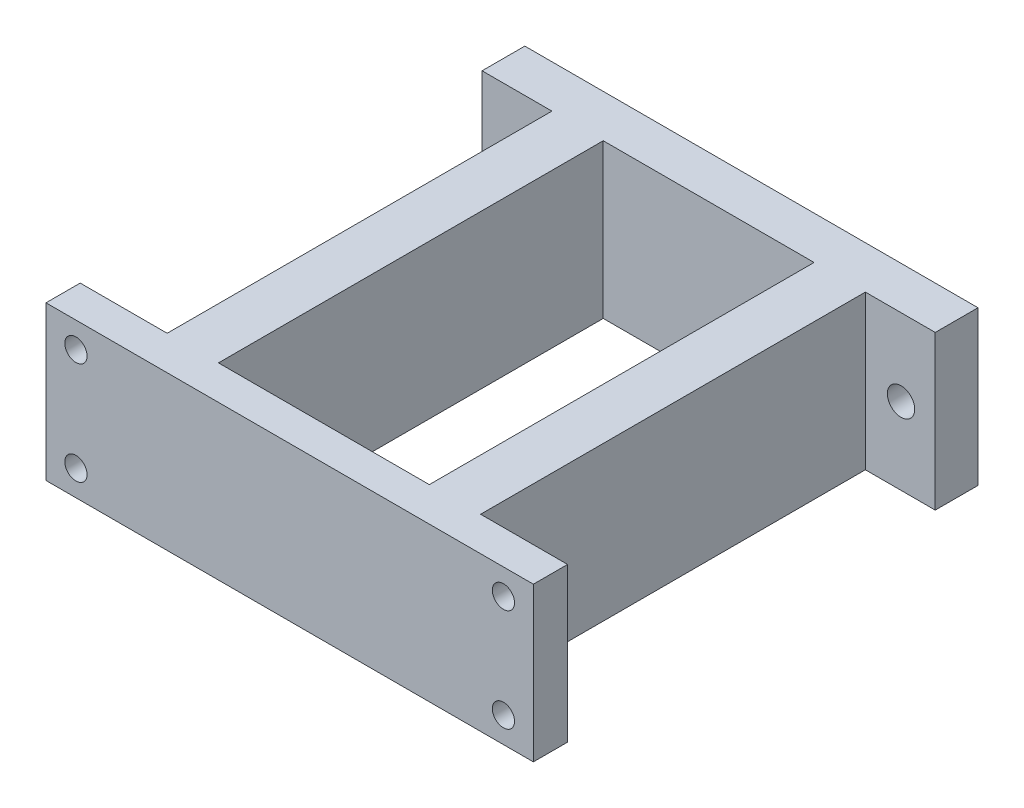
ISO-10303-21;
HEADER;
FILE_DESCRIPTION(('STEP AP214'),'2;1');
FILE_NAME('part.step','',(''),(''),'','','');
FILE_SCHEMA(('AUTOMOTIVE_DESIGN { 1 0 10303 214 1 1 1 1 }'));
ENDSEC;
DATA;
#1=APPLICATION_CONTEXT('core data for automotive mechanical design processes');
#2=APPLICATION_PROTOCOL_DEFINITION('international standard','automotive_design',2000,#1);
#3=PRODUCT_CONTEXT('',#1,'mechanical');
#4=PRODUCT('Part','Part','',(#3));
#5=PRODUCT_RELATED_PRODUCT_CATEGORY('part','',(#4));
#6=PRODUCT_DEFINITION_FORMATION('','',#4);
#7=PRODUCT_DEFINITION_CONTEXT('part definition',#1,'design');
#8=PRODUCT_DEFINITION('design','',#6,#7);
#9=PRODUCT_DEFINITION_SHAPE('','',#8);
#10=(LENGTH_UNIT() NAMED_UNIT(*) SI_UNIT(.MILLI.,.METRE.));
#11=(NAMED_UNIT(*) PLANE_ANGLE_UNIT() SI_UNIT($,.RADIAN.));
#12=(NAMED_UNIT(*) SI_UNIT($,.STERADIAN.) SOLID_ANGLE_UNIT());
#13=UNCERTAINTY_MEASURE_WITH_UNIT(LENGTH_MEASURE(1.E-05),#10,'distance_accuracy_value','');
#14=(GEOMETRIC_REPRESENTATION_CONTEXT(3) GLOBAL_UNCERTAINTY_ASSIGNED_CONTEXT((#13)) GLOBAL_UNIT_ASSIGNED_CONTEXT((#10,
#11,#12)) REPRESENTATION_CONTEXT('',''));
#15=CARTESIAN_POINT('',(0.,0.,0.));
#16=DIRECTION('',(0.,0.,1.));
#17=DIRECTION('',(1.,0.,0.));
#18=AXIS2_PLACEMENT_3D('',#15,#16,#17);
#19=CARTESIAN_POINT('',(0.,0.,4.));
#20=DIRECTION('',(0.,0.,-1.));
#21=DIRECTION('',(-1.,0.,0.));
#22=AXIS2_PLACEMENT_3D('',#19,#20,#21);
#23=PLANE('',#22);
#24=CARTESIAN_POINT('',(-9.,-6.,4.));
#25=DIRECTION('',(0.,0.,-1.));
#26=DIRECTION('',(-1.,0.,0.));
#27=AXIS2_PLACEMENT_3D('',#24,#25,#26);
#28=CIRCLE('',#27,1.3);
#29=CARTESIAN_POINT('',(-10.3,-6.,4.));
#30=VERTEX_POINT('',#29);
#31=EDGE_CURVE('E262',#30,#30,#28,.T.);
#32=ORIENTED_EDGE('',*,*,#31,.T.);
#33=EDGE_LOOP('',(#32));
#34=FACE_BOUND('',#33,.T.);
#35=CARTESIAN_POINT('',(-9.,6.,4.));
#36=DIRECTION('',(0.,0.,-1.));
#37=DIRECTION('',(-1.,0.,0.));
#38=AXIS2_PLACEMENT_3D('',#35,#36,#37);
#39=CIRCLE('',#38,1.3);
#40=CARTESIAN_POINT('',(-10.3,6.,4.));
#41=VERTEX_POINT('',#40);
#42=EDGE_CURVE('E253',#41,#41,#39,.F.);
#43=ORIENTED_EDGE('',*,*,#42,.F.);
#44=EDGE_LOOP('',(#43));
#45=FACE_BOUND('',#44,.T.);
#46=CARTESIAN_POINT('',(-59.,-6.,4.));
#47=DIRECTION('',(0.,0.,-1.));
#48=DIRECTION('',(-1.,0.,0.));
#49=AXIS2_PLACEMENT_3D('',#46,#47,#48);
#50=CIRCLE('',#49,1.3);
#51=CARTESIAN_POINT('',(-60.3,-6.,4.));
#52=VERTEX_POINT('',#51);
#53=EDGE_CURVE('E256',#52,#52,#50,.F.);
#54=ORIENTED_EDGE('',*,*,#53,.F.);
#55=EDGE_LOOP('',(#54));
#56=FACE_BOUND('',#55,.T.);
#57=CARTESIAN_POINT('',(-59.,6.,4.));
#58=DIRECTION('',(0.,0.,-1.));
#59=DIRECTION('',(-1.,0.,0.));
#60=AXIS2_PLACEMENT_3D('',#57,#58,#59);
#61=CIRCLE('',#60,1.3);
#62=CARTESIAN_POINT('',(-60.3,6.,4.));
#63=VERTEX_POINT('',#62);
#64=EDGE_CURVE('E259',#63,#63,#61,.T.);
#65=ORIENTED_EDGE('',*,*,#64,.T.);
#66=EDGE_LOOP('',(#65));
#67=FACE_BOUND('',#66,.T.);
#68=DIRECTION('',(-1.,0.,0.));
#69=VECTOR('',#68,1.);
#70=CARTESIAN_POINT('',(-2.5,9.,4.));
#71=LINE('',#70,#69);
#72=CARTESIAN_POINT('',(-5.5,9.,4.));
#73=VERTEX_POINT('',#72);
#74=CARTESIAN_POINT('',(-62.5,9.,4.));
#75=VERTEX_POINT('',#74);
#76=EDGE_CURVE('E155',#73,#75,#71,.T.);
#77=ORIENTED_EDGE('',*,*,#76,.T.);
#78=DIRECTION('',(0.,-1.,0.));
#79=VECTOR('',#78,1.);
#80=CARTESIAN_POINT('',(-62.5,9.,4.));
#81=LINE('',#80,#79);
#82=CARTESIAN_POINT('',(-62.5,-9.,4.));
#83=VERTEX_POINT('',#82);
#84=EDGE_CURVE('E157',#75,#83,#81,.T.);
#85=ORIENTED_EDGE('',*,*,#84,.T.);
#86=DIRECTION('',(1.,0.,0.));
#87=VECTOR('',#86,1.);
#88=CARTESIAN_POINT('',(-2.5,-9.,4.));
#89=LINE('',#88,#87);
#90=CARTESIAN_POINT('',(-5.49999999999999,-9.,4.));
#91=VERTEX_POINT('',#90);
#92=EDGE_CURVE('E165',#83,#91,#89,.T.);
#93=ORIENTED_EDGE('',*,*,#92,.T.);
#94=DIRECTION('',(0.,-1.,0.));
#95=VECTOR('',#94,1.);
#96=CARTESIAN_POINT('',(-5.5,9.,4.));
#97=LINE('',#96,#95);
#98=EDGE_CURVE('E160',#73,#91,#97,.T.);
#99=ORIENTED_EDGE('',*,*,#98,.F.);
#100=EDGE_LOOP('',(#77,#85,#93,#99));
#101=FACE_BOUND('',#100,.T.);
#102=ADVANCED_FACE('F41',(#34,#45,#56,#67,#101),#23,.F.);
#103=CARTESIAN_POINT('',(-2.5,9.,4.));
#104=DIRECTION('',(0.,-1.,0.));
#105=DIRECTION('',(0.,0.,-1.));
#106=AXIS2_PLACEMENT_3D('',#103,#104,#105);
#107=PLANE('',#106);
#108=DIRECTION('',(1.,0.,0.));
#109=VECTOR('',#108,1.);
#110=CARTESIAN_POINT('',(-60.5,9.,-45.));
#111=LINE('',#110,#109);
#112=CARTESIAN_POINT('',(-46.3292949073472,9.,-45.));
#113=VERTEX_POINT('',#112);
#114=CARTESIAN_POINT('',(-21.6707050926528,9.,-45.));
#115=VERTEX_POINT('',#114);
#116=EDGE_CURVE('E291',#113,#115,#111,.T.);
#117=ORIENTED_EDGE('',*,*,#116,.T.);
#118=DIRECTION('',(0.,0.,1.));
#119=VECTOR('',#118,1.);
#120=CARTESIAN_POINT('',(-21.6707050926528,9.,-63.9736659610103));
#121=LINE('',#120,#119);
#122=CARTESIAN_POINT('',(-21.6707050926528,9.,0.));
#123=VERTEX_POINT('',#122);
#124=EDGE_CURVE('E202',#115,#123,#121,.T.);
#125=ORIENTED_EDGE('',*,*,#124,.T.);
#126=DIRECTION('',(1.,0.,0.));
#127=VECTOR('',#126,1.);
#128=CARTESIAN_POINT('',(-78.9390889145858,9.,0.));
#129=LINE('',#128,#127);
#130=CARTESIAN_POINT('',(-46.3292949073472,9.,0.));
#131=VERTEX_POINT('',#130);
#132=EDGE_CURVE('E268',#131,#123,#129,.T.);
#133=ORIENTED_EDGE('',*,*,#132,.F.);
#134=DIRECTION('',(0.,0.,1.));
#135=VECTOR('',#134,1.);
#136=CARTESIAN_POINT('',(-46.3292949073472,9.,-63.9736659610103));
#137=LINE('',#136,#135);
#138=EDGE_CURVE('E209',#113,#131,#137,.T.);
#139=ORIENTED_EDGE('',*,*,#138,.F.);
#140=EDGE_LOOP('',(#117,#125,#133,#139));
#141=FACE_BOUND('',#140,.T.);
#142=CARTESIAN_POINT('',(-62.5,9.,0.));
#143=VERTEX_POINT('',#142);
#144=CARTESIAN_POINT('',(-52.3292949073472,9.,0.));
#145=VERTEX_POINT('',#144);
#146=EDGE_CURVE('E177',#143,#145,#129,.T.);
#147=ORIENTED_EDGE('',*,*,#146,.F.);
#148=DIRECTION('',(0.,0.,1.));
#149=VECTOR('',#148,1.);
#150=CARTESIAN_POINT('',(-62.5,9.,4.));
#151=LINE('',#150,#149);
#152=EDGE_CURVE('E171',#143,#75,#151,.T.);
#153=ORIENTED_EDGE('',*,*,#152,.T.);
#154=ORIENTED_EDGE('',*,*,#76,.F.);
#155=DIRECTION('',(0.,0.,1.));
#156=VECTOR('',#155,1.);
#157=CARTESIAN_POINT('',(-5.5,9.,4.));
#158=LINE('',#157,#156);
#159=CARTESIAN_POINT('',(-5.5,9.,0.));
#160=VERTEX_POINT('',#159);
#161=EDGE_CURVE('E193',#160,#73,#158,.T.);
#162=ORIENTED_EDGE('',*,*,#161,.F.);
#163=CARTESIAN_POINT('',(-15.6707050926528,9.,0.));
#164=VERTEX_POINT('',#163);
#165=EDGE_CURVE('E265',#164,#160,#129,.T.);
#166=ORIENTED_EDGE('',*,*,#165,.F.);
#167=DIRECTION('',(0.,0.,1.));
#168=VECTOR('',#167,1.);
#169=CARTESIAN_POINT('',(-15.6707050926528,9.,-63.9736659610103));
#170=LINE('',#169,#168);
#171=CARTESIAN_POINT('',(-15.6707050926528,9.,-45.));
#172=VERTEX_POINT('',#171);
#173=EDGE_CURVE('E228',#172,#164,#170,.T.);
#174=ORIENTED_EDGE('',*,*,#173,.F.);
#175=CARTESIAN_POINT('',(-7.5,9.,-45.));
#176=VERTEX_POINT('',#175);
#177=EDGE_CURVE('E282',#172,#176,#111,.T.);
#178=ORIENTED_EDGE('',*,*,#177,.T.);
#179=DIRECTION('',(0.,0.,1.));
#180=VECTOR('',#179,1.);
#181=CARTESIAN_POINT('',(-7.5,9.,-73.));
#182=LINE('',#181,#180);
#183=CARTESIAN_POINT('',(-7.5,9.,-50.));
#184=VERTEX_POINT('',#183);
#185=EDGE_CURVE('E195',#184,#176,#182,.T.);
#186=ORIENTED_EDGE('',*,*,#185,.F.);
#187=DIRECTION('',(-1.,0.,0.));
#188=VECTOR('',#187,1.);
#189=CARTESIAN_POINT('',(-7.5,9.,-50.));
#190=LINE('',#189,#188);
#191=CARTESIAN_POINT('',(-60.5,9.,-50.));
#192=VERTEX_POINT('',#191);
#193=EDGE_CURVE('E294',#184,#192,#190,.T.);
#194=ORIENTED_EDGE('',*,*,#193,.T.);
#195=DIRECTION('',(0.,0.,1.));
#196=VECTOR('',#195,1.);
#197=CARTESIAN_POINT('',(-60.5,9.,-73.));
#198=LINE('',#197,#196);
#199=CARTESIAN_POINT('',(-60.5,9.,-45.));
#200=VERTEX_POINT('',#199);
#201=EDGE_CURVE('E56',#192,#200,#198,.T.);
#202=ORIENTED_EDGE('',*,*,#201,.T.);
#203=CARTESIAN_POINT('',(-52.3292949073472,9.,-45.));
#204=VERTEX_POINT('',#203);
#205=EDGE_CURVE('E287',#200,#204,#111,.T.);
#206=ORIENTED_EDGE('',*,*,#205,.T.);
#207=DIRECTION('',(0.,0.,1.));
#208=VECTOR('',#207,1.);
#209=CARTESIAN_POINT('',(-52.3292949073472,9.,-63.9736659610103));
#210=LINE('',#209,#208);
#211=EDGE_CURVE('E211',#204,#145,#210,.T.);
#212=ORIENTED_EDGE('',*,*,#211,.T.);
#213=EDGE_LOOP('',(#147,#153,#154,#162,#166,#174,#178,#186,#194,#202,#206,#212));
#214=FACE_BOUND('',#213,.T.);
#215=ADVANCED_FACE('F43',(#141,#214),#107,.F.);
#216=CARTESIAN_POINT('',(-2.5,-9.,4.));
#217=DIRECTION('',(0.,1.,0.));
#218=DIRECTION('',(0.,0.,1.));
#219=AXIS2_PLACEMENT_3D('',#216,#217,#218);
#220=PLANE('',#219);
#221=DIRECTION('',(0.,0.,1.));
#222=VECTOR('',#221,1.);
#223=CARTESIAN_POINT('',(-21.6707050926528,-9.,-63.9736659610103));
#224=LINE('',#223,#222);
#225=CARTESIAN_POINT('',(-21.6707050926528,-9.,-45.));
#226=VERTEX_POINT('',#225);
#227=CARTESIAN_POINT('',(-21.6707050926528,-9.,0.));
#228=VERTEX_POINT('',#227);
#229=EDGE_CURVE('E223',#226,#228,#224,.T.);
#230=ORIENTED_EDGE('',*,*,#229,.F.);
#231=DIRECTION('',(1.,0.,0.));
#232=VECTOR('',#231,1.);
#233=CARTESIAN_POINT('',(-60.5,-9.,-45.));
#234=LINE('',#233,#232);
#235=CARTESIAN_POINT('',(-46.3292949073472,-9.,-45.));
#236=VERTEX_POINT('',#235);
#237=EDGE_CURVE('E295',#236,#226,#234,.T.);
#238=ORIENTED_EDGE('',*,*,#237,.F.);
#239=DIRECTION('',(0.,0.,1.));
#240=VECTOR('',#239,1.);
#241=CARTESIAN_POINT('',(-46.3292949073472,-9.,-63.9736659610103));
#242=LINE('',#241,#240);
#243=CARTESIAN_POINT('',(-46.3292949073472,-9.,0.));
#244=VERTEX_POINT('',#243);
#245=EDGE_CURVE('E204',#236,#244,#242,.T.);
#246=ORIENTED_EDGE('',*,*,#245,.T.);
#247=DIRECTION('',(1.,0.,0.));
#248=VECTOR('',#247,1.);
#249=CARTESIAN_POINT('',(-78.9390889145858,-9.,0.));
#250=LINE('',#249,#248);
#251=EDGE_CURVE('E273',#244,#228,#250,.T.);
#252=ORIENTED_EDGE('',*,*,#251,.T.);
#253=EDGE_LOOP('',(#230,#238,#246,#252));
#254=FACE_BOUND('',#253,.T.);
#255=DIRECTION('',(0.,0.,1.));
#256=VECTOR('',#255,1.);
#257=CARTESIAN_POINT('',(-60.5,-9.,-73.));
#258=LINE('',#257,#256);
#259=CARTESIAN_POINT('',(-60.5,-9.,-50.));
#260=VERTEX_POINT('',#259);
#261=CARTESIAN_POINT('',(-60.5,-9.,-45.));
#262=VERTEX_POINT('',#261);
#263=EDGE_CURVE('E183',#260,#262,#258,.T.);
#264=ORIENTED_EDGE('',*,*,#263,.F.);
#265=DIRECTION('',(1.,0.,0.));
#266=VECTOR('',#265,1.);
#267=CARTESIAN_POINT('',(-2.5,-9.,-50.));
#268=LINE('',#267,#266);
#269=CARTESIAN_POINT('',(-7.5,-9.,-50.));
#270=VERTEX_POINT('',#269);
#271=EDGE_CURVE('E63',#260,#270,#268,.T.);
#272=ORIENTED_EDGE('',*,*,#271,.T.);
#273=DIRECTION('',(0.,0.,1.));
#274=VECTOR('',#273,1.);
#275=CARTESIAN_POINT('',(-7.49999999999999,-9.,-73.));
#276=LINE('',#275,#274);
#277=CARTESIAN_POINT('',(-7.49999999999999,-9.,-45.));
#278=VERTEX_POINT('',#277);
#279=EDGE_CURVE('E196',#270,#278,#276,.T.);
#280=ORIENTED_EDGE('',*,*,#279,.T.);
#281=CARTESIAN_POINT('',(-15.6707050926528,-9.,-45.));
#282=VERTEX_POINT('',#281);
#283=EDGE_CURVE('E290',#282,#278,#234,.T.);
#284=ORIENTED_EDGE('',*,*,#283,.F.);
#285=DIRECTION('',(0.,0.,1.));
#286=VECTOR('',#285,1.);
#287=CARTESIAN_POINT('',(-15.6707050926528,-9.,-63.9736659610103));
#288=LINE('',#287,#286);
#289=CARTESIAN_POINT('',(-15.6707050926528,-9.,0.));
#290=VERTEX_POINT('',#289);
#291=EDGE_CURVE('E227',#282,#290,#288,.T.);
#292=ORIENTED_EDGE('',*,*,#291,.T.);
#293=CARTESIAN_POINT('',(-5.49999999999999,-9.,0.));
#294=VERTEX_POINT('',#293);
#295=EDGE_CURVE('E267',#290,#294,#250,.T.);
#296=ORIENTED_EDGE('',*,*,#295,.T.);
#297=DIRECTION('',(0.,0.,-1.));
#298=VECTOR('',#297,1.);
#299=CARTESIAN_POINT('',(-5.49999999999999,-9.,4.));
#300=LINE('',#299,#298);
#301=EDGE_CURVE('E187',#91,#294,#300,.T.);
#302=ORIENTED_EDGE('',*,*,#301,.F.);
#303=ORIENTED_EDGE('',*,*,#92,.F.);
#304=DIRECTION('',(0.,0.,-1.));
#305=VECTOR('',#304,1.);
#306=CARTESIAN_POINT('',(-62.5,-9.,4.));
#307=LINE('',#306,#305);
#308=CARTESIAN_POINT('',(-62.5,-9.,0.));
#309=VERTEX_POINT('',#308);
#310=EDGE_CURVE('E174',#83,#309,#307,.T.);
#311=ORIENTED_EDGE('',*,*,#310,.T.);
#312=CARTESIAN_POINT('',(-52.3292949073472,-9.,0.));
#313=VERTEX_POINT('',#312);
#314=EDGE_CURVE('E269',#309,#313,#250,.T.);
#315=ORIENTED_EDGE('',*,*,#314,.T.);
#316=DIRECTION('',(0.,0.,1.));
#317=VECTOR('',#316,1.);
#318=CARTESIAN_POINT('',(-52.3292949073472,-9.,-63.9736659610103));
#319=LINE('',#318,#317);
#320=CARTESIAN_POINT('',(-52.3292949073472,-9.,-45.));
#321=VERTEX_POINT('',#320);
#322=EDGE_CURVE('E200',#321,#313,#319,.T.);
#323=ORIENTED_EDGE('',*,*,#322,.F.);
#324=EDGE_CURVE('E292',#262,#321,#234,.T.);
#325=ORIENTED_EDGE('',*,*,#324,.F.);
#326=EDGE_LOOP('',(#264,#272,#280,#284,#292,#296,#302,#303,#311,#315,#323,#325));
#327=FACE_BOUND('',#326,.T.);
#328=ADVANCED_FACE('F314',(#254,#327),#220,.F.);
#329=CARTESIAN_POINT('',(0.,0.,-50.));
#330=DIRECTION('',(0.,0.,-1.));
#331=DIRECTION('',(-1.,0.,0.));
#332=AXIS2_PLACEMENT_3D('',#329,#330,#331);
#333=PLANE('',#332);
#334=CARTESIAN_POINT('',(-11.5,0.,-50.));
#335=DIRECTION('',(0.,0.,-1.));
#336=DIRECTION('',(-1.,0.,0.));
#337=AXIS2_PLACEMENT_3D('',#334,#335,#336);
#338=CIRCLE('',#337,1.6);
#339=CARTESIAN_POINT('',(-13.1,0.,-50.));
#340=VERTEX_POINT('',#339);
#341=EDGE_CURVE('E274',#340,#340,#338,.T.);
#342=ORIENTED_EDGE('',*,*,#341,.F.);
#343=EDGE_LOOP('',(#342));
#344=FACE_BOUND('',#343,.T.);
#345=CARTESIAN_POINT('',(-56.5,0.,-50.));
#346=DIRECTION('',(0.,0.,-1.));
#347=DIRECTION('',(1.,0.,0.));
#348=AXIS2_PLACEMENT_3D('',#345,#346,#347);
#349=CIRCLE('',#348,1.59999999999999);
#350=CARTESIAN_POINT('',(-54.9,0.,-50.));
#351=VERTEX_POINT('',#350);
#352=EDGE_CURVE('E272',#351,#351,#349,.T.);
#353=ORIENTED_EDGE('',*,*,#352,.F.);
#354=EDGE_LOOP('',(#353));
#355=FACE_BOUND('',#354,.T.);
#356=ORIENTED_EDGE('',*,*,#271,.F.);
#357=DIRECTION('',(0.,1.,0.));
#358=VECTOR('',#357,1.);
#359=CARTESIAN_POINT('',(-60.5,0.,-50.));
#360=LINE('',#359,#358);
#361=EDGE_CURVE('E11',#260,#192,#360,.T.);
#362=ORIENTED_EDGE('',*,*,#361,.T.);
#363=ORIENTED_EDGE('',*,*,#193,.F.);
#364=DIRECTION('',(0.,1.,0.));
#365=VECTOR('',#364,1.);
#366=CARTESIAN_POINT('',(-7.5,0.,-50.));
#367=LINE('',#366,#365);
#368=EDGE_CURVE('E49',#270,#184,#367,.T.);
#369=ORIENTED_EDGE('',*,*,#368,.F.);
#370=EDGE_LOOP('',(#356,#362,#363,#369));
#371=FACE_BOUND('',#370,.T.);
#372=ADVANCED_FACE('F311',(#344,#355,#371),#333,.T.);
#373=CARTESIAN_POINT('',(-78.9390889145858,9.,0.));
#374=DIRECTION('',(0.,0.,1.));
#375=DIRECTION('',(1.,0.,0.));
#376=AXIS2_PLACEMENT_3D('',#373,#374,#375);
#377=PLANE('',#376);
#378=CARTESIAN_POINT('',(-59.,6.,0.));
#379=DIRECTION('',(0.,0.,-1.));
#380=DIRECTION('',(-1.,0.,0.));
#381=AXIS2_PLACEMENT_3D('',#378,#379,#380);
#382=CIRCLE('',#381,1.3);
#383=CARTESIAN_POINT('',(-60.3,6.,0.));
#384=VERTEX_POINT('',#383);
#385=EDGE_CURVE('E244',#384,#384,#382,.T.);
#386=ORIENTED_EDGE('',*,*,#385,.F.);
#387=EDGE_LOOP('',(#386));
#388=FACE_BOUND('',#387,.T.);
#389=CARTESIAN_POINT('',(-59.,-6.,0.));
#390=DIRECTION('',(0.,0.,1.));
#391=DIRECTION('',(1.,0.,0.));
#392=AXIS2_PLACEMENT_3D('',#389,#390,#391);
#393=CIRCLE('',#392,1.3);
#394=CARTESIAN_POINT('',(-57.7,-6.,0.));
#395=VERTEX_POINT('',#394);
#396=EDGE_CURVE('E231',#395,#395,#393,.T.);
#397=ORIENTED_EDGE('',*,*,#396,.T.);
#398=EDGE_LOOP('',(#397));
#399=FACE_BOUND('',#398,.T.);
#400=DIRECTION('',(0.,1.,0.));
#401=VECTOR('',#400,1.);
#402=CARTESIAN_POINT('',(-52.3292949073472,9.,0.));
#403=LINE('',#402,#401);
#404=EDGE_CURVE('E203',#313,#145,#403,.T.);
#405=ORIENTED_EDGE('',*,*,#404,.F.);
#406=ORIENTED_EDGE('',*,*,#314,.F.);
#407=DIRECTION('',(0.,1.,0.));
#408=VECTOR('',#407,1.);
#409=CARTESIAN_POINT('',(-62.5,9.,0.));
#410=LINE('',#409,#408);
#411=EDGE_CURVE('E178',#309,#143,#410,.T.);
#412=ORIENTED_EDGE('',*,*,#411,.T.);
#413=ORIENTED_EDGE('',*,*,#146,.T.);
#414=EDGE_LOOP('',(#405,#406,#412,#413));
#415=FACE_BOUND('',#414,.T.);
#416=ADVANCED_FACE('F326',(#388,#399,#415),#377,.F.);
#417=DIRECTION('',(0.,-1.,0.));
#418=VECTOR('',#417,1.);
#419=CARTESIAN_POINT('',(-46.3292949073472,9.,0.));
#420=LINE('',#419,#418);
#421=EDGE_CURVE('E207',#131,#244,#420,.T.);
#422=ORIENTED_EDGE('',*,*,#421,.F.);
#423=ORIENTED_EDGE('',*,*,#132,.T.);
#424=DIRECTION('',(0.,1.,0.));
#425=VECTOR('',#424,1.);
#426=CARTESIAN_POINT('',(-21.6707050926528,9.,0.));
#427=LINE('',#426,#425);
#428=EDGE_CURVE('E219',#228,#123,#427,.T.);
#429=ORIENTED_EDGE('',*,*,#428,.F.);
#430=ORIENTED_EDGE('',*,*,#251,.F.);
#431=EDGE_LOOP('',(#422,#423,#429,#430));
#432=FACE_BOUND('',#431,.T.);
#433=ADVANCED_FACE('F360',(#432),#377,.F.);
#434=CARTESIAN_POINT('',(-60.5,-9.,-45.));
#435=DIRECTION('',(0.,0.,-1.));
#436=DIRECTION('',(-1.,0.,0.));
#437=AXIS2_PLACEMENT_3D('',#434,#435,#436);
#438=PLANE('',#437);
#439=CARTESIAN_POINT('',(-56.5,0.,-45.));
#440=DIRECTION('',(0.,0.,-1.));
#441=DIRECTION('',(-1.,0.,0.));
#442=AXIS2_PLACEMENT_3D('',#439,#440,#441);
#443=CIRCLE('',#442,1.59999999999999);
#444=CARTESIAN_POINT('',(-58.1,0.,-45.));
#445=VERTEX_POINT('',#444);
#446=EDGE_CURVE('E277',#445,#445,#443,.T.);
#447=ORIENTED_EDGE('',*,*,#446,.T.);
#448=EDGE_LOOP('',(#447));
#449=FACE_BOUND('',#448,.T.);
#450=DIRECTION('',(0.,1.,0.));
#451=VECTOR('',#450,1.);
#452=CARTESIAN_POINT('',(-52.3292949073472,9.,-45.));
#453=LINE('',#452,#451);
#454=EDGE_CURVE('E208',#321,#204,#453,.T.);
#455=ORIENTED_EDGE('',*,*,#454,.T.);
#456=ORIENTED_EDGE('',*,*,#205,.F.);
#457=DIRECTION('',(0.,1.,0.));
#458=VECTOR('',#457,1.);
#459=CARTESIAN_POINT('',(-60.5,-9.,-45.));
#460=LINE('',#459,#458);
#461=EDGE_CURVE('E280',#262,#200,#460,.T.);
#462=ORIENTED_EDGE('',*,*,#461,.F.);
#463=ORIENTED_EDGE('',*,*,#324,.T.);
#464=EDGE_LOOP('',(#455,#456,#462,#463));
#465=FACE_BOUND('',#464,.T.);
#466=ADVANCED_FACE('F320',(#449,#465),#438,.F.);
#467=DIRECTION('',(0.,-1.,0.));
#468=VECTOR('',#467,1.);
#469=CARTESIAN_POINT('',(-46.3292949073472,9.,-45.));
#470=LINE('',#469,#468);
#471=EDGE_CURVE('E198',#113,#236,#470,.T.);
#472=ORIENTED_EDGE('',*,*,#471,.T.);
#473=ORIENTED_EDGE('',*,*,#237,.T.);
#474=DIRECTION('',(0.,1.,0.));
#475=VECTOR('',#474,1.);
#476=CARTESIAN_POINT('',(-21.6707050926528,9.,-45.));
#477=LINE('',#476,#475);
#478=EDGE_CURVE('E222',#226,#115,#477,.T.);
#479=ORIENTED_EDGE('',*,*,#478,.T.);
#480=ORIENTED_EDGE('',*,*,#116,.F.);
#481=EDGE_LOOP('',(#472,#473,#479,#480));
#482=FACE_BOUND('',#481,.T.);
#483=ADVANCED_FACE('F343',(#482),#438,.F.);
#484=CARTESIAN_POINT('',(-9.,-6.,0.));
#485=DIRECTION('',(0.,0.,-1.));
#486=DIRECTION('',(-1.,0.,0.));
#487=AXIS2_PLACEMENT_3D('',#484,#485,#486);
#488=CIRCLE('',#487,1.3);
#489=CARTESIAN_POINT('',(-10.3,-6.,0.));
#490=VERTEX_POINT('',#489);
#491=EDGE_CURVE('E245',#490,#490,#488,.T.);
#492=ORIENTED_EDGE('',*,*,#491,.F.);
#493=EDGE_LOOP('',(#492));
#494=FACE_BOUND('',#493,.T.);
#495=CARTESIAN_POINT('',(-9.,6.,0.));
#496=DIRECTION('',(0.,0.,1.));
#497=DIRECTION('',(1.,0.,0.));
#498=AXIS2_PLACEMENT_3D('',#495,#496,#497);
#499=CIRCLE('',#498,1.3);
#500=CARTESIAN_POINT('',(-7.7,6.,0.));
#501=VERTEX_POINT('',#500);
#502=EDGE_CURVE('E248',#501,#501,#499,.T.);
#503=ORIENTED_EDGE('',*,*,#502,.T.);
#504=EDGE_LOOP('',(#503));
#505=FACE_BOUND('',#504,.T.);
#506=DIRECTION('',(0.,-1.,0.));
#507=VECTOR('',#506,1.);
#508=CARTESIAN_POINT('',(-15.6707050926528,9.,0.));
#509=LINE('',#508,#507);
#510=EDGE_CURVE('E224',#164,#290,#509,.T.);
#511=ORIENTED_EDGE('',*,*,#510,.F.);
#512=ORIENTED_EDGE('',*,*,#165,.T.);
#513=DIRECTION('',(0.,1.,0.));
#514=VECTOR('',#513,1.);
#515=CARTESIAN_POINT('',(-5.5,9.,0.));
#516=LINE('',#515,#514);
#517=EDGE_CURVE('E190',#294,#160,#516,.T.);
#518=ORIENTED_EDGE('',*,*,#517,.F.);
#519=ORIENTED_EDGE('',*,*,#295,.F.);
#520=EDGE_LOOP('',(#511,#512,#518,#519));
#521=FACE_BOUND('',#520,.T.);
#522=ADVANCED_FACE('F363',(#494,#505,#521),#377,.F.);
#523=CARTESIAN_POINT('',(-11.5,0.,-45.));
#524=DIRECTION('',(0.,0.,-1.));
#525=DIRECTION('',(-1.,0.,0.));
#526=AXIS2_PLACEMENT_3D('',#523,#524,#525);
#527=CIRCLE('',#526,1.6);
#528=CARTESIAN_POINT('',(-13.1,0.,-45.));
#529=VERTEX_POINT('',#528);
#530=EDGE_CURVE('E286',#529,#529,#527,.T.);
#531=ORIENTED_EDGE('',*,*,#530,.T.);
#532=EDGE_LOOP('',(#531));
#533=FACE_BOUND('',#532,.T.);
#534=DIRECTION('',(0.,-1.,0.));
#535=VECTOR('',#534,1.);
#536=CARTESIAN_POINT('',(-15.6707050926528,9.,-45.));
#537=LINE('',#536,#535);
#538=EDGE_CURVE('E229',#172,#282,#537,.T.);
#539=ORIENTED_EDGE('',*,*,#538,.T.);
#540=ORIENTED_EDGE('',*,*,#283,.T.);
#541=DIRECTION('',(0.,1.,0.));
#542=VECTOR('',#541,1.);
#543=CARTESIAN_POINT('',(-7.5,-9.,-45.));
#544=LINE('',#543,#542);
#545=EDGE_CURVE('E283',#278,#176,#544,.T.);
#546=ORIENTED_EDGE('',*,*,#545,.T.);
#547=ORIENTED_EDGE('',*,*,#177,.F.);
#548=EDGE_LOOP('',(#539,#540,#546,#547));
#549=FACE_BOUND('',#548,.T.);
#550=ADVANCED_FACE('F340',(#533,#549),#438,.F.);
#551=CARTESIAN_POINT('',(-56.5,0.,0.));
#552=DIRECTION('',(0.,0.,-1.));
#553=DIRECTION('',(-1.,0.,0.));
#554=AXIS2_PLACEMENT_3D('',#551,#552,#553);
#555=CYLINDRICAL_SURFACE('',#554,1.59999999999999);
#556=ORIENTED_EDGE('',*,*,#352,.T.);
#557=EDGE_LOOP('',(#556));
#558=FACE_BOUND('',#557,.T.);
#559=ORIENTED_EDGE('',*,*,#446,.F.);
#560=EDGE_LOOP('',(#559));
#561=FACE_BOUND('',#560,.T.);
#562=ADVANCED_FACE('F397',(#558,#561),#555,.F.);
#563=CARTESIAN_POINT('',(-11.5,0.,0.));
#564=DIRECTION('',(0.,0.,-1.));
#565=DIRECTION('',(-1.,0.,0.));
#566=AXIS2_PLACEMENT_3D('',#563,#564,#565);
#567=CYLINDRICAL_SURFACE('',#566,1.6);
#568=ORIENTED_EDGE('',*,*,#341,.T.);
#569=EDGE_LOOP('',(#568));
#570=FACE_BOUND('',#569,.T.);
#571=ORIENTED_EDGE('',*,*,#530,.F.);
#572=EDGE_LOOP('',(#571));
#573=FACE_BOUND('',#572,.T.);
#574=ADVANCED_FACE('F400',(#570,#573),#567,.F.);
#575=CARTESIAN_POINT('',(-9.,6.,12.));
#576=DIRECTION('',(0.,0.,-1.));
#577=DIRECTION('',(-1.,0.,0.));
#578=AXIS2_PLACEMENT_3D('',#575,#576,#577);
#579=CYLINDRICAL_SURFACE('',#578,1.3);
#580=ORIENTED_EDGE('',*,*,#502,.F.);
#581=EDGE_LOOP('',(#580));
#582=FACE_BOUND('',#581,.T.);
#583=ORIENTED_EDGE('',*,*,#42,.T.);
#584=EDGE_LOOP('',(#583));
#585=FACE_BOUND('',#584,.T.);
#586=ADVANCED_FACE('F406',(#582,#585),#579,.F.);
#587=CARTESIAN_POINT('',(-59.,-6.,12.));
#588=DIRECTION('',(0.,0.,-1.));
#589=DIRECTION('',(-1.,0.,0.));
#590=AXIS2_PLACEMENT_3D('',#587,#588,#589);
#591=CYLINDRICAL_SURFACE('',#590,1.3);
#592=ORIENTED_EDGE('',*,*,#396,.F.);
#593=EDGE_LOOP('',(#592));
#594=FACE_BOUND('',#593,.T.);
#595=ORIENTED_EDGE('',*,*,#53,.T.);
#596=EDGE_LOOP('',(#595));
#597=FACE_BOUND('',#596,.T.);
#598=ADVANCED_FACE('F591',(#594,#597),#591,.F.);
#599=CARTESIAN_POINT('',(-59.,6.,12.));
#600=DIRECTION('',(0.,0.,-1.));
#601=DIRECTION('',(-1.,0.,0.));
#602=AXIS2_PLACEMENT_3D('',#599,#600,#601);
#603=CYLINDRICAL_SURFACE('',#602,1.3);
#604=ORIENTED_EDGE('',*,*,#385,.T.);
#605=EDGE_LOOP('',(#604));
#606=FACE_BOUND('',#605,.T.);
#607=ORIENTED_EDGE('',*,*,#64,.F.);
#608=EDGE_LOOP('',(#607));
#609=FACE_BOUND('',#608,.T.);
#610=ADVANCED_FACE('F594',(#606,#609),#603,.F.);
#611=CARTESIAN_POINT('',(-9.,-6.,12.));
#612=DIRECTION('',(0.,0.,-1.));
#613=DIRECTION('',(-1.,0.,0.));
#614=AXIS2_PLACEMENT_3D('',#611,#612,#613);
#615=CYLINDRICAL_SURFACE('',#614,1.3);
#616=ORIENTED_EDGE('',*,*,#491,.T.);
#617=EDGE_LOOP('',(#616));
#618=FACE_BOUND('',#617,.T.);
#619=ORIENTED_EDGE('',*,*,#31,.F.);
#620=EDGE_LOOP('',(#619));
#621=FACE_BOUND('',#620,.T.);
#622=ADVANCED_FACE('F425',(#618,#621),#615,.F.);
#623=CARTESIAN_POINT('',(-15.6707050926528,9.,-63.9736659610103));
#624=DIRECTION('',(-1.,0.,0.));
#625=DIRECTION('',(0.,0.,1.));
#626=AXIS2_PLACEMENT_3D('',#623,#624,#625);
#627=PLANE('',#626);
#628=ORIENTED_EDGE('',*,*,#538,.F.);
#629=ORIENTED_EDGE('',*,*,#173,.T.);
#630=ORIENTED_EDGE('',*,*,#510,.T.);
#631=ORIENTED_EDGE('',*,*,#291,.F.);
#632=EDGE_LOOP('',(#628,#629,#630,#631));
#633=FACE_BOUND('',#632,.T.);
#634=ADVANCED_FACE('F335',(#633),#627,.F.);
#635=CARTESIAN_POINT('',(-21.6707050926528,9.,-63.9736659610103));
#636=DIRECTION('',(1.,0.,0.));
#637=DIRECTION('',(0.,0.,-1.));
#638=AXIS2_PLACEMENT_3D('',#635,#636,#637);
#639=PLANE('',#638);
#640=ORIENTED_EDGE('',*,*,#478,.F.);
#641=ORIENTED_EDGE('',*,*,#229,.T.);
#642=ORIENTED_EDGE('',*,*,#428,.T.);
#643=ORIENTED_EDGE('',*,*,#124,.F.);
#644=EDGE_LOOP('',(#640,#641,#642,#643));
#645=FACE_BOUND('',#644,.T.);
#646=ADVANCED_FACE('F352',(#645),#639,.F.);
#647=CARTESIAN_POINT('',(-52.3292949073472,9.,-63.9736659610103));
#648=DIRECTION('',(1.,0.,0.));
#649=DIRECTION('',(0.,0.,-1.));
#650=AXIS2_PLACEMENT_3D('',#647,#648,#649);
#651=PLANE('',#650);
#652=ORIENTED_EDGE('',*,*,#454,.F.);
#653=ORIENTED_EDGE('',*,*,#322,.T.);
#654=ORIENTED_EDGE('',*,*,#404,.T.);
#655=ORIENTED_EDGE('',*,*,#211,.F.);
#656=EDGE_LOOP('',(#652,#653,#654,#655));
#657=FACE_BOUND('',#656,.T.);
#658=ADVANCED_FACE('F323',(#657),#651,.F.);
#659=CARTESIAN_POINT('',(-46.3292949073472,9.,-63.9736659610103));
#660=DIRECTION('',(-1.,0.,0.));
#661=DIRECTION('',(0.,0.,1.));
#662=AXIS2_PLACEMENT_3D('',#659,#660,#661);
#663=PLANE('',#662);
#664=ORIENTED_EDGE('',*,*,#471,.F.);
#665=ORIENTED_EDGE('',*,*,#138,.T.);
#666=ORIENTED_EDGE('',*,*,#421,.T.);
#667=ORIENTED_EDGE('',*,*,#245,.F.);
#668=EDGE_LOOP('',(#664,#665,#666,#667));
#669=FACE_BOUND('',#668,.T.);
#670=ADVANCED_FACE('F357',(#669),#663,.F.);
#671=CARTESIAN_POINT('',(-7.5,9.,-73.));
#672=DIRECTION('',(-1.,0.,0.));
#673=DIRECTION('',(0.,-1.,0.));
#674=AXIS2_PLACEMENT_3D('',#671,#672,#673);
#675=PLANE('',#674);
#676=ORIENTED_EDGE('',*,*,#279,.F.);
#677=ORIENTED_EDGE('',*,*,#368,.T.);
#678=ORIENTED_EDGE('',*,*,#185,.T.);
#679=ORIENTED_EDGE('',*,*,#545,.F.);
#680=EDGE_LOOP('',(#676,#677,#678,#679));
#681=FACE_BOUND('',#680,.T.);
#682=ADVANCED_FACE('F306',(#681),#675,.F.);
#683=CARTESIAN_POINT('',(-5.5,0.,0.));
#684=DIRECTION('',(1.,0.,0.));
#685=DIRECTION('',(0.,1.,0.));
#686=AXIS2_PLACEMENT_3D('',#683,#684,#685);
#687=PLANE('',#686);
#688=ORIENTED_EDGE('',*,*,#98,.T.);
#689=ORIENTED_EDGE('',*,*,#301,.T.);
#690=ORIENTED_EDGE('',*,*,#517,.T.);
#691=ORIENTED_EDGE('',*,*,#161,.T.);
#692=EDGE_LOOP('',(#688,#689,#690,#691));
#693=FACE_BOUND('',#692,.T.);
#694=ADVANCED_FACE('F330',(#693),#687,.T.);
#695=CARTESIAN_POINT('',(-60.5,9.,-73.));
#696=DIRECTION('',(-1.,0.,0.));
#697=DIRECTION('',(0.,-1.,0.));
#698=AXIS2_PLACEMENT_3D('',#695,#696,#697);
#699=PLANE('',#698);
#700=ORIENTED_EDGE('',*,*,#461,.T.);
#701=ORIENTED_EDGE('',*,*,#201,.F.);
#702=ORIENTED_EDGE('',*,*,#361,.F.);
#703=ORIENTED_EDGE('',*,*,#263,.T.);
#704=EDGE_LOOP('',(#700,#701,#702,#703));
#705=FACE_BOUND('',#704,.T.);
#706=ADVANCED_FACE('F312',(#705),#699,.T.);
#707=CARTESIAN_POINT('',(-62.5,0.,0.));
#708=DIRECTION('',(-1.,0.,0.));
#709=DIRECTION('',(0.,1.,0.));
#710=AXIS2_PLACEMENT_3D('',#707,#708,#709);
#711=PLANE('',#710);
#712=ORIENTED_EDGE('',*,*,#84,.F.);
#713=ORIENTED_EDGE('',*,*,#152,.F.);
#714=ORIENTED_EDGE('',*,*,#411,.F.);
#715=ORIENTED_EDGE('',*,*,#310,.F.);
#716=EDGE_LOOP('',(#712,#713,#714,#715));
#717=FACE_BOUND('',#716,.T.);
#718=ADVANCED_FACE('F169',(#717),#711,.T.);
#719=CLOSED_SHELL('',(#102,#215,#328,#372,#416,#433,#466,#483,#522,#550,#562,#574,#586,#598,
#610,#622,#634,#646,#658,#670,#682,#694,#706,#718));
#720=MANIFOLD_SOLID_BREP('B2',#719);
#721=ADVANCED_BREP_SHAPE_REPRESENTATION('',(#18,#720),#14);
#722=SHAPE_DEFINITION_REPRESENTATION(#9,#721);
ENDSEC;
END-ISO-10303-21;
